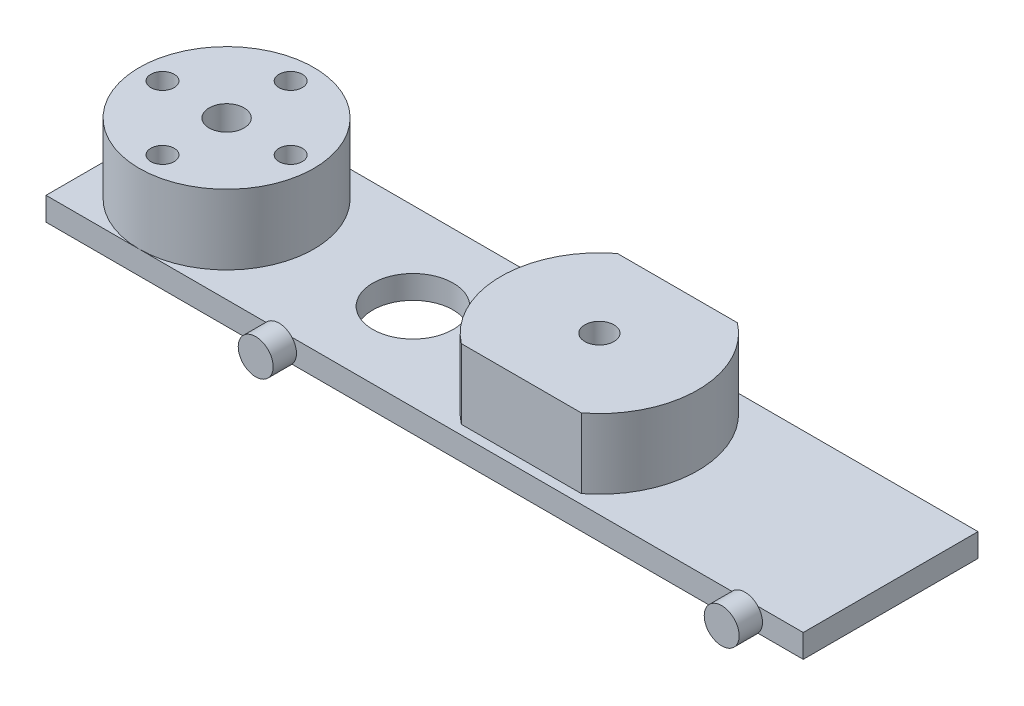
ISO-10303-21;
HEADER;
FILE_DESCRIPTION(('STEP AP214'),'2;1');
FILE_NAME('part.step','',(''),(''),'','','');
FILE_SCHEMA(('AUTOMOTIVE_DESIGN { 1 0 10303 214 1 1 1 1 }'));
ENDSEC;
DATA;
#1=APPLICATION_CONTEXT('core data for automotive mechanical design processes');
#2=APPLICATION_PROTOCOL_DEFINITION('international standard','automotive_design',2000,#1);
#3=PRODUCT_CONTEXT('',#1,'mechanical');
#4=PRODUCT('Part','Part','',(#3));
#5=PRODUCT_RELATED_PRODUCT_CATEGORY('part','',(#4));
#6=PRODUCT_DEFINITION_FORMATION('','',#4);
#7=PRODUCT_DEFINITION_CONTEXT('part definition',#1,'design');
#8=PRODUCT_DEFINITION('design','',#6,#7);
#9=PRODUCT_DEFINITION_SHAPE('','',#8);
#10=(LENGTH_UNIT() NAMED_UNIT(*) SI_UNIT(.MILLI.,.METRE.));
#11=(NAMED_UNIT(*) PLANE_ANGLE_UNIT() SI_UNIT($,.RADIAN.));
#12=(NAMED_UNIT(*) SI_UNIT($,.STERADIAN.) SOLID_ANGLE_UNIT());
#13=UNCERTAINTY_MEASURE_WITH_UNIT(LENGTH_MEASURE(1.E-05),#10,'distance_accuracy_value','');
#14=(GEOMETRIC_REPRESENTATION_CONTEXT(3) GLOBAL_UNCERTAINTY_ASSIGNED_CONTEXT((#13)) GLOBAL_UNIT_ASSIGNED_CONTEXT((#10,
#11,#12)) REPRESENTATION_CONTEXT('',''));
#15=CARTESIAN_POINT('',(0.,0.,0.));
#16=DIRECTION('',(0.,0.,1.));
#17=DIRECTION('',(1.,0.,0.));
#18=AXIS2_PLACEMENT_3D('',#15,#16,#17);
#19=CARTESIAN_POINT('',(0.,0.,0.));
#20=DIRECTION('',(0.,1.,0.));
#21=DIRECTION('',(0.,0.,1.));
#22=AXIS2_PLACEMENT_3D('',#19,#20,#21);
#23=PLANE('',#22);
#24=CARTESIAN_POINT('',(-16.,0.,0.));
#25=DIRECTION('',(0.,-1.,0.));
#26=DIRECTION('',(0.,0.,-1.));
#27=AXIS2_PLACEMENT_3D('',#24,#25,#26);
#28=CIRCLE('',#27,3.45);
#29=CARTESIAN_POINT('',(-16.,0.,-3.45));
#30=VERTEX_POINT('',#29);
#31=EDGE_CURVE('E365',#30,#30,#28,.T.);
#32=ORIENTED_EDGE('',*,*,#31,.F.);
#33=EDGE_LOOP('',(#32));
#34=FACE_BOUND('',#33,.T.);
#35=DIRECTION('',(0.,0.,-1.));
#36=VECTOR('',#35,1.);
#37=CARTESIAN_POINT('',(-40.,0.,0.));
#38=LINE('',#37,#36);
#39=CARTESIAN_POINT('',(-40.,0.,7.5));
#40=VERTEX_POINT('',#39);
#41=CARTESIAN_POINT('',(-40.,0.,-7.5));
#42=VERTEX_POINT('',#41);
#43=EDGE_CURVE('E386',#40,#42,#38,.T.);
#44=ORIENTED_EDGE('',*,*,#43,.T.);
#45=DIRECTION('',(-1.,0.,0.));
#46=VECTOR('',#45,1.);
#47=CARTESIAN_POINT('',(0.,0.,-7.5));
#48=LINE('',#47,#46);
#49=CARTESIAN_POINT('',(25.,0.,-7.5));
#50=VERTEX_POINT('',#49);
#51=EDGE_CURVE('E375',#50,#42,#48,.T.);
#52=ORIENTED_EDGE('',*,*,#51,.F.);
#53=DIRECTION('',(0.,0.,1.));
#54=VECTOR('',#53,1.);
#55=CARTESIAN_POINT('',(25.,0.,-7.5));
#56=LINE('',#55,#54);
#57=CARTESIAN_POINT('',(25.,0.,7.5));
#58=VERTEX_POINT('',#57);
#59=EDGE_CURVE('E369',#50,#58,#56,.T.);
#60=ORIENTED_EDGE('',*,*,#59,.T.);
#61=DIRECTION('',(-1.,0.,0.));
#62=VECTOR('',#61,1.);
#63=CARTESIAN_POINT('',(0.,0.,7.5));
#64=LINE('',#63,#62);
#65=CARTESIAN_POINT('',(21.1180339887499,0.,7.5));
#66=VERTEX_POINT('',#65);
#67=EDGE_CURVE('E392',#58,#66,#64,.T.);
#68=ORIENTED_EDGE('',*,*,#67,.T.);
#69=CARTESIAN_POINT('',(18.8819660112501,0.,7.5));
#70=VERTEX_POINT('',#69);
#71=EDGE_CURVE('E396',#66,#70,#64,.T.);
#72=ORIENTED_EDGE('',*,*,#71,.T.);
#73=CARTESIAN_POINT('',(-18.8819660112501,0.,7.5));
#74=VERTEX_POINT('',#73);
#75=EDGE_CURVE('E630',#70,#74,#64,.T.);
#76=ORIENTED_EDGE('',*,*,#75,.T.);
#77=CARTESIAN_POINT('',(-21.1180339887499,0.,7.5));
#78=VERTEX_POINT('',#77);
#79=EDGE_CURVE('E587',#74,#78,#64,.T.);
#80=ORIENTED_EDGE('',*,*,#79,.T.);
#81=EDGE_CURVE('E390',#78,#40,#64,.T.);
#82=ORIENTED_EDGE('',*,*,#81,.T.);
#83=EDGE_LOOP('',(#44,#52,#60,#68,#72,#76,#80,#82));
#84=FACE_BOUND('',#83,.T.);
#85=CARTESIAN_POINT('',(-32.,0.,0.));
#86=DIRECTION('',(0.,1.,0.));
#87=DIRECTION('',(0.,0.,1.));
#88=AXIS2_PLACEMENT_3D('',#85,#86,#87);
#89=CIRCLE('',#88,7.2);
#90=CARTESIAN_POINT('',(-32.,0.,7.2));
#91=VERTEX_POINT('',#90);
#92=EDGE_CURVE('E280',#91,#91,#89,.T.);
#93=ORIENTED_EDGE('',*,*,#92,.T.);
#94=EDGE_LOOP('',(#93));
#95=FACE_BOUND('',#94,.T.);
#96=DIRECTION('',(-1.,0.,0.));
#97=VECTOR('',#96,1.);
#98=CARTESIAN_POINT('',(0.,0.,6.));
#99=LINE('',#98,#97);
#100=CARTESIAN_POINT('',(4.90535421758714,0.,6.));
#101=VERTEX_POINT('',#100);
#102=CARTESIAN_POINT('',(-4.90535421758714,0.,6.));
#103=VERTEX_POINT('',#102);
#104=EDGE_CURVE('E13',#101,#103,#99,.T.);
#105=ORIENTED_EDGE('',*,*,#104,.F.);
#106=CARTESIAN_POINT('',(0.,0.,0.));
#107=DIRECTION('',(0.,1.,0.));
#108=DIRECTION('',(0.,0.,1.));
#109=AXIS2_PLACEMENT_3D('',#106,#107,#108);
#110=CIRCLE('',#109,7.75);
#111=CARTESIAN_POINT('',(4.90535421758714,0.,-6.));
#112=VERTEX_POINT('',#111);
#113=EDGE_CURVE('E423',#101,#112,#110,.T.);
#114=ORIENTED_EDGE('',*,*,#113,.T.);
#115=DIRECTION('',(-1.,0.,0.));
#116=VECTOR('',#115,1.);
#117=CARTESIAN_POINT('',(0.,0.,-6.));
#118=LINE('',#117,#116);
#119=CARTESIAN_POINT('',(-4.90535421758714,0.,-6.));
#120=VERTEX_POINT('',#119);
#121=EDGE_CURVE('E427',#112,#120,#118,.T.);
#122=ORIENTED_EDGE('',*,*,#121,.T.);
#123=CARTESIAN_POINT('',(0.,0.,0.));
#124=DIRECTION('',(0.,1.,0.));
#125=DIRECTION('',(0.,0.,1.));
#126=AXIS2_PLACEMENT_3D('',#123,#124,#125);
#127=CIRCLE('',#126,7.75);
#128=EDGE_CURVE('E131',#120,#103,#127,.T.);
#129=ORIENTED_EDGE('',*,*,#128,.T.);
#130=EDGE_LOOP('',(#105,#114,#122,#129));
#131=FACE_BOUND('',#130,.T.);
#132=ADVANCED_FACE('F121',(#34,#84,#95,#131),#23,.F.);
#133=CARTESIAN_POINT('',(0.,2.,0.));
#134=DIRECTION('',(0.,1.,0.));
#135=DIRECTION('',(0.,0.,1.));
#136=AXIS2_PLACEMENT_3D('',#133,#134,#135);
#137=PLANE('',#136);
#138=DIRECTION('',(-1.,0.,0.));
#139=VECTOR('',#138,1.);
#140=CARTESIAN_POINT('',(0.,2.,7.5));
#141=LINE('',#140,#139);
#142=CARTESIAN_POINT('',(-32.,2.,7.5));
#143=VERTEX_POINT('',#142);
#144=CARTESIAN_POINT('',(-40.,2.,7.5));
#145=VERTEX_POINT('',#144);
#146=EDGE_CURVE('E374',#143,#145,#141,.T.);
#147=ORIENTED_EDGE('',*,*,#146,.F.);
#148=CARTESIAN_POINT('',(-32.,2.,0.));
#149=DIRECTION('',(0.,1.,0.));
#150=DIRECTION('',(0.,0.,1.));
#151=AXIS2_PLACEMENT_3D('',#148,#149,#150);
#152=CIRCLE('',#151,7.5);
#153=CARTESIAN_POINT('',(-32.,2.,-7.5));
#154=VERTEX_POINT('',#153);
#155=EDGE_CURVE('E303',#154,#143,#152,.T.);
#156=ORIENTED_EDGE('',*,*,#155,.F.);
#157=DIRECTION('',(-1.,0.,0.));
#158=VECTOR('',#157,1.);
#159=CARTESIAN_POINT('',(0.,2.,-7.5));
#160=LINE('',#159,#158);
#161=CARTESIAN_POINT('',(-40.,2.,-7.5));
#162=VERTEX_POINT('',#161);
#163=EDGE_CURVE('E379',#154,#162,#160,.T.);
#164=ORIENTED_EDGE('',*,*,#163,.T.);
#165=DIRECTION('',(0.,0.,-1.));
#166=VECTOR('',#165,1.);
#167=CARTESIAN_POINT('',(-40.,2.,0.));
#168=LINE('',#167,#166);
#169=EDGE_CURVE('E370',#145,#162,#168,.T.);
#170=ORIENTED_EDGE('',*,*,#169,.F.);
#171=EDGE_LOOP('',(#147,#156,#164,#170));
#172=FACE_BOUND('',#171,.T.);
#173=ADVANCED_FACE('F478',(#172),#137,.T.);
#174=CARTESIAN_POINT('',(-16.,2.,0.));
#175=DIRECTION('',(0.,1.,0.));
#176=DIRECTION('',(0.,0.,1.));
#177=AXIS2_PLACEMENT_3D('',#174,#175,#176);
#178=CIRCLE('',#177,3.45);
#179=CARTESIAN_POINT('',(-16.,2.,3.45));
#180=VERTEX_POINT('',#179);
#181=EDGE_CURVE('E346',#180,#180,#178,.F.);
#182=ORIENTED_EDGE('',*,*,#181,.T.);
#183=EDGE_LOOP('',(#182));
#184=FACE_BOUND('',#183,.T.);
#185=DIRECTION('',(-1.,0.,0.));
#186=VECTOR('',#185,1.);
#187=CARTESIAN_POINT('',(5.14902903468217,2.,-6.7));
#188=LINE('',#187,#186);
#189=CARTESIAN_POINT('',(5.14902903468217,2.,-6.7));
#190=VERTEX_POINT('',#189);
#191=CARTESIAN_POINT('',(-5.14902903468217,2.,-6.7));
#192=VERTEX_POINT('',#191);
#193=EDGE_CURVE('E324',#190,#192,#188,.T.);
#194=ORIENTED_EDGE('',*,*,#193,.F.);
#195=CARTESIAN_POINT('',(0.,2.,0.));
#196=DIRECTION('',(0.,1.,0.));
#197=DIRECTION('',(0.,0.,1.));
#198=AXIS2_PLACEMENT_3D('',#195,#196,#197);
#199=CIRCLE('',#198,8.45);
#200=CARTESIAN_POINT('',(5.14902903468217,2.,6.7));
#201=VERTEX_POINT('',#200);
#202=EDGE_CURVE('E327',#201,#190,#199,.T.);
#203=ORIENTED_EDGE('',*,*,#202,.F.);
#204=DIRECTION('',(1.,0.,0.));
#205=VECTOR('',#204,1.);
#206=CARTESIAN_POINT('',(5.14902903468217,2.,6.7));
#207=LINE('',#206,#205);
#208=CARTESIAN_POINT('',(-5.14902903468217,2.,6.7));
#209=VERTEX_POINT('',#208);
#210=EDGE_CURVE('E317',#209,#201,#207,.T.);
#211=ORIENTED_EDGE('',*,*,#210,.F.);
#212=CARTESIAN_POINT('',(0.,2.,0.));
#213=DIRECTION('',(0.,1.,0.));
#214=DIRECTION('',(0.,0.,1.));
#215=AXIS2_PLACEMENT_3D('',#212,#213,#214);
#216=CIRCLE('',#215,8.45);
#217=EDGE_CURVE('E320',#192,#209,#216,.T.);
#218=ORIENTED_EDGE('',*,*,#217,.F.);
#219=EDGE_LOOP('',(#194,#203,#211,#218));
#220=FACE_BOUND('',#219,.T.);
#221=CARTESIAN_POINT('',(25.,2.,-7.5));
#222=VERTEX_POINT('',#221);
#223=EDGE_CURVE('E381',#222,#154,#160,.T.);
#224=ORIENTED_EDGE('',*,*,#223,.T.);
#225=EDGE_CURVE('E300',#143,#154,#152,.T.);
#226=ORIENTED_EDGE('',*,*,#225,.F.);
#227=CARTESIAN_POINT('',(-21.1180339887499,2.,7.5));
#228=VERTEX_POINT('',#227);
#229=EDGE_CURVE('E594',#228,#143,#141,.T.);
#230=ORIENTED_EDGE('',*,*,#229,.F.);
#231=CARTESIAN_POINT('',(-18.8819660112501,2.,7.5));
#232=VERTEX_POINT('',#231);
#233=EDGE_CURVE('E598',#232,#228,#141,.T.);
#234=ORIENTED_EDGE('',*,*,#233,.F.);
#235=CARTESIAN_POINT('',(18.8819660112501,2.,7.5));
#236=VERTEX_POINT('',#235);
#237=EDGE_CURVE('E601',#236,#232,#141,.T.);
#238=ORIENTED_EDGE('',*,*,#237,.F.);
#239=CARTESIAN_POINT('',(21.1180339887499,2.,7.5));
#240=VERTEX_POINT('',#239);
#241=EDGE_CURVE('E380',#240,#236,#141,.T.);
#242=ORIENTED_EDGE('',*,*,#241,.F.);
#243=CARTESIAN_POINT('',(25.,2.,7.5));
#244=VERTEX_POINT('',#243);
#245=EDGE_CURVE('E376',#244,#240,#141,.T.);
#246=ORIENTED_EDGE('',*,*,#245,.F.);
#247=DIRECTION('',(0.,0.,1.));
#248=VECTOR('',#247,1.);
#249=CARTESIAN_POINT('',(25.,2.,-7.5));
#250=LINE('',#249,#248);
#251=EDGE_CURVE('E406',#222,#244,#250,.T.);
#252=ORIENTED_EDGE('',*,*,#251,.F.);
#253=EDGE_LOOP('',(#224,#226,#230,#234,#238,#242,#246,#252));
#254=FACE_BOUND('',#253,.T.);
#255=ADVANCED_FACE('F561',(#184,#220,#254),#137,.T.);
#256=CARTESIAN_POINT('',(0.,2.,7.5));
#257=DIRECTION('',(0.,0.,1.));
#258=DIRECTION('',(1.,0.,0.));
#259=AXIS2_PLACEMENT_3D('',#256,#257,#258);
#260=PLANE('',#259);
#261=CARTESIAN_POINT('',(20.,0.999999999999999,7.5));
#262=DIRECTION('',(0.,0.,1.));
#263=DIRECTION('',(1.,0.,0.));
#264=AXIS2_PLACEMENT_3D('',#261,#262,#263);
#265=CIRCLE('',#264,1.5);
#266=EDGE_CURVE('E428',#236,#70,#265,.T.);
#267=ORIENTED_EDGE('',*,*,#266,.F.);
#268=ORIENTED_EDGE('',*,*,#237,.T.);
#269=CARTESIAN_POINT('',(-20.,0.999999999999995,7.5));
#270=DIRECTION('',(0.,0.,1.));
#271=DIRECTION('',(1.,0.,0.));
#272=AXIS2_PLACEMENT_3D('',#269,#270,#271);
#273=CIRCLE('',#272,1.5);
#274=EDGE_CURVE('E358',#74,#232,#273,.T.);
#275=ORIENTED_EDGE('',*,*,#274,.F.);
#276=ORIENTED_EDGE('',*,*,#75,.F.);
#277=EDGE_LOOP('',(#267,#268,#275,#276));
#278=FACE_BOUND('',#277,.T.);
#279=ADVANCED_FACE('F572',(#278),#260,.T.);
#280=EDGE_CURVE('E620',#228,#78,#273,.T.);
#281=ORIENTED_EDGE('',*,*,#280,.F.);
#282=ORIENTED_EDGE('',*,*,#229,.T.);
#283=ORIENTED_EDGE('',*,*,#146,.T.);
#284=DIRECTION('',(0.,-1.,0.));
#285=VECTOR('',#284,1.);
#286=CARTESIAN_POINT('',(-40.,2.,7.5));
#287=LINE('',#286,#285);
#288=EDGE_CURVE('E402',#145,#40,#287,.T.);
#289=ORIENTED_EDGE('',*,*,#288,.T.);
#290=ORIENTED_EDGE('',*,*,#81,.F.);
#291=EDGE_LOOP('',(#281,#282,#283,#289,#290));
#292=FACE_BOUND('',#291,.T.);
#293=ADVANCED_FACE('F568',(#292),#260,.T.);
#294=CARTESIAN_POINT('',(0.,2.,-7.5));
#295=DIRECTION('',(0.,0.,1.));
#296=DIRECTION('',(1.,0.,0.));
#297=AXIS2_PLACEMENT_3D('',#294,#295,#296);
#298=PLANE('',#297);
#299=ORIENTED_EDGE('',*,*,#51,.T.);
#300=DIRECTION('',(0.,-1.,0.));
#301=VECTOR('',#300,1.);
#302=CARTESIAN_POINT('',(-40.,2.,-7.5));
#303=LINE('',#302,#301);
#304=EDGE_CURVE('E385',#162,#42,#303,.T.);
#305=ORIENTED_EDGE('',*,*,#304,.F.);
#306=ORIENTED_EDGE('',*,*,#163,.F.);
#307=ORIENTED_EDGE('',*,*,#223,.F.);
#308=DIRECTION('',(0.,-1.,0.));
#309=VECTOR('',#308,1.);
#310=CARTESIAN_POINT('',(25.,2.,-7.5));
#311=LINE('',#310,#309);
#312=EDGE_CURVE('E410',#222,#50,#311,.T.);
#313=ORIENTED_EDGE('',*,*,#312,.T.);
#314=EDGE_LOOP('',(#299,#305,#306,#307,#313));
#315=FACE_BOUND('',#314,.T.);
#316=ADVANCED_FACE('F564',(#315),#298,.F.);
#317=EDGE_CURVE('E352',#66,#240,#265,.T.);
#318=ORIENTED_EDGE('',*,*,#317,.F.);
#319=ORIENTED_EDGE('',*,*,#67,.F.);
#320=DIRECTION('',(0.,-1.,0.));
#321=VECTOR('',#320,1.);
#322=CARTESIAN_POINT('',(25.,2.,7.5));
#323=LINE('',#322,#321);
#324=EDGE_CURVE('E391',#244,#58,#323,.T.);
#325=ORIENTED_EDGE('',*,*,#324,.F.);
#326=ORIENTED_EDGE('',*,*,#245,.T.);
#327=EDGE_LOOP('',(#318,#319,#325,#326));
#328=FACE_BOUND('',#327,.T.);
#329=ADVANCED_FACE('F567',(#328),#260,.T.);
#330=CARTESIAN_POINT('',(-40.,2.,0.));
#331=DIRECTION('',(-1.,0.,0.));
#332=DIRECTION('',(0.,0.,1.));
#333=AXIS2_PLACEMENT_3D('',#330,#331,#332);
#334=PLANE('',#333);
#335=ORIENTED_EDGE('',*,*,#43,.F.);
#336=ORIENTED_EDGE('',*,*,#288,.F.);
#337=ORIENTED_EDGE('',*,*,#169,.T.);
#338=ORIENTED_EDGE('',*,*,#304,.T.);
#339=EDGE_LOOP('',(#335,#336,#337,#338));
#340=FACE_BOUND('',#339,.T.);
#341=ADVANCED_FACE('F559',(#340),#334,.T.);
#342=CARTESIAN_POINT('',(25.,2.,-7.5));
#343=DIRECTION('',(1.,0.,0.));
#344=DIRECTION('',(0.,0.,-1.));
#345=AXIS2_PLACEMENT_3D('',#342,#343,#344);
#346=PLANE('',#345);
#347=ORIENTED_EDGE('',*,*,#59,.F.);
#348=ORIENTED_EDGE('',*,*,#312,.F.);
#349=ORIENTED_EDGE('',*,*,#251,.T.);
#350=ORIENTED_EDGE('',*,*,#324,.T.);
#351=EDGE_LOOP('',(#347,#348,#349,#350));
#352=FACE_BOUND('',#351,.T.);
#353=ADVANCED_FACE('F123',(#352),#346,.T.);
#354=CARTESIAN_POINT('',(-16.,11.7580735803744,0.));
#355=DIRECTION('',(0.,-1.,0.));
#356=DIRECTION('',(0.,0.,-1.));
#357=AXIS2_PLACEMENT_3D('',#354,#355,#356);
#358=CYLINDRICAL_SURFACE('',#357,3.45);
#359=ORIENTED_EDGE('',*,*,#31,.T.);
#360=EDGE_LOOP('',(#359));
#361=FACE_BOUND('',#360,.T.);
#362=ORIENTED_EDGE('',*,*,#181,.F.);
#363=EDGE_LOOP('',(#362));
#364=FACE_BOUND('',#363,.T.);
#365=ADVANCED_FACE('F554',(#361,#364),#358,.F.);
#366=CARTESIAN_POINT('',(0.,11.7580735803744,0.));
#367=DIRECTION('',(0.,-1.,0.));
#368=DIRECTION('',(0.,0.,-1.));
#369=AXIS2_PLACEMENT_3D('',#366,#367,#368);
#370=CYLINDRICAL_SURFACE('',#369,1.25);
#371=CARTESIAN_POINT('',(0.,5.5,0.));
#372=DIRECTION('',(0.,1.,0.));
#373=DIRECTION('',(0.,0.,1.));
#374=AXIS2_PLACEMENT_3D('',#371,#372,#373);
#375=CIRCLE('',#374,1.25);
#376=CARTESIAN_POINT('',(0.,5.5,1.25));
#377=VERTEX_POINT('',#376);
#378=EDGE_CURVE('E265',#377,#377,#375,.F.);
#379=ORIENTED_EDGE('',*,*,#378,.T.);
#380=EDGE_LOOP('',(#379));
#381=FACE_BOUND('',#380,.T.);
#382=CARTESIAN_POINT('',(0.,8.,0.));
#383=DIRECTION('',(0.,1.,0.));
#384=DIRECTION('',(0.,0.,1.));
#385=AXIS2_PLACEMENT_3D('',#382,#383,#384);
#386=CIRCLE('',#385,1.25);
#387=CARTESIAN_POINT('',(0.,8.,1.25));
#388=VERTEX_POINT('',#387);
#389=EDGE_CURVE('E290',#388,#388,#386,.F.);
#390=ORIENTED_EDGE('',*,*,#389,.F.);
#391=EDGE_LOOP('',(#390));
#392=FACE_BOUND('',#391,.T.);
#393=ADVANCED_FACE('F551',(#381,#392),#370,.F.);
#394=CARTESIAN_POINT('',(-20.,0.999999999999995,7.5));
#395=DIRECTION('',(0.,0.,1.));
#396=DIRECTION('',(1.,0.,0.));
#397=AXIS2_PLACEMENT_3D('',#394,#395,#396);
#398=PLANE('',#397);
#399=EDGE_CURVE('E353',#232,#228,#273,.T.);
#400=ORIENTED_EDGE('',*,*,#399,.F.);
#401=ORIENTED_EDGE('',*,*,#233,.T.);
#402=EDGE_LOOP('',(#400,#401));
#403=FACE_BOUND('',#402,.T.);
#404=ADVANCED_FACE('F542',(#403),#398,.F.);
#405=CARTESIAN_POINT('',(-20.,0.999999999999995,9.5));
#406=DIRECTION('',(0.,0.,-1.));
#407=DIRECTION('',(-1.,0.,0.));
#408=AXIS2_PLACEMENT_3D('',#405,#406,#407);
#409=CYLINDRICAL_SURFACE('',#408,1.5);
#410=CARTESIAN_POINT('',(-20.,0.999999999999995,9.5));
#411=DIRECTION('',(0.,0.,1.));
#412=DIRECTION('',(1.,0.,0.));
#413=AXIS2_PLACEMENT_3D('',#410,#411,#412);
#414=CIRCLE('',#413,1.5);
#415=CARTESIAN_POINT('',(-18.5,0.999999999999995,9.5));
#416=VERTEX_POINT('',#415);
#417=EDGE_CURVE('E299',#416,#416,#414,.T.);
#418=ORIENTED_EDGE('',*,*,#417,.F.);
#419=EDGE_LOOP('',(#418));
#420=FACE_BOUND('',#419,.T.);
#421=ORIENTED_EDGE('',*,*,#399,.T.);
#422=ORIENTED_EDGE('',*,*,#280,.T.);
#423=EDGE_CURVE('E357',#78,#74,#273,.T.);
#424=ORIENTED_EDGE('',*,*,#423,.T.);
#425=ORIENTED_EDGE('',*,*,#274,.T.);
#426=EDGE_LOOP('',(#421,#422,#424,#425));
#427=FACE_BOUND('',#426,.T.);
#428=ADVANCED_FACE('F538',(#420,#427),#409,.T.);
#429=CARTESIAN_POINT('',(-20.,0.999999999999995,9.5));
#430=DIRECTION('',(0.,0.,1.));
#431=DIRECTION('',(1.,0.,0.));
#432=AXIS2_PLACEMENT_3D('',#429,#430,#431);
#433=PLANE('',#432);
#434=ORIENTED_EDGE('',*,*,#417,.T.);
#435=EDGE_LOOP('',(#434));
#436=FACE_BOUND('',#435,.T.);
#437=ADVANCED_FACE('F541',(#436),#433,.T.);
#438=ORIENTED_EDGE('',*,*,#79,.F.);
#439=ORIENTED_EDGE('',*,*,#423,.F.);
#440=EDGE_LOOP('',(#438,#439));
#441=FACE_BOUND('',#440,.T.);
#442=ADVANCED_FACE('F544',(#441),#398,.F.);
#443=CARTESIAN_POINT('',(20.,0.999999999999999,7.5));
#444=DIRECTION('',(0.,0.,1.));
#445=DIRECTION('',(1.,0.,0.));
#446=AXIS2_PLACEMENT_3D('',#443,#444,#445);
#447=PLANE('',#446);
#448=EDGE_CURVE('E347',#240,#236,#265,.T.);
#449=ORIENTED_EDGE('',*,*,#448,.F.);
#450=ORIENTED_EDGE('',*,*,#241,.T.);
#451=EDGE_LOOP('',(#449,#450));
#452=FACE_BOUND('',#451,.T.);
#453=ADVANCED_FACE('F534',(#452),#447,.F.);
#454=CARTESIAN_POINT('',(20.,0.999999999999999,9.5));
#455=DIRECTION('',(0.,0.,-1.));
#456=DIRECTION('',(-1.,0.,0.));
#457=AXIS2_PLACEMENT_3D('',#454,#455,#456);
#458=CYLINDRICAL_SURFACE('',#457,1.5);
#459=CARTESIAN_POINT('',(20.,0.999999999999999,9.5));
#460=DIRECTION('',(0.,0.,1.));
#461=DIRECTION('',(1.,0.,0.));
#462=AXIS2_PLACEMENT_3D('',#459,#460,#461);
#463=CIRCLE('',#462,1.5);
#464=CARTESIAN_POINT('',(21.5,0.999999999999999,9.5));
#465=VERTEX_POINT('',#464);
#466=EDGE_CURVE('E342',#465,#465,#463,.T.);
#467=ORIENTED_EDGE('',*,*,#466,.F.);
#468=EDGE_LOOP('',(#467));
#469=FACE_BOUND('',#468,.T.);
#470=ORIENTED_EDGE('',*,*,#448,.T.);
#471=ORIENTED_EDGE('',*,*,#266,.T.);
#472=EDGE_CURVE('E351',#70,#66,#265,.T.);
#473=ORIENTED_EDGE('',*,*,#472,.T.);
#474=ORIENTED_EDGE('',*,*,#317,.T.);
#475=EDGE_LOOP('',(#470,#471,#473,#474));
#476=FACE_BOUND('',#475,.T.);
#477=ADVANCED_FACE('F529',(#469,#476),#458,.T.);
#478=CARTESIAN_POINT('',(20.,0.999999999999999,9.5));
#479=DIRECTION('',(0.,0.,1.));
#480=DIRECTION('',(1.,0.,0.));
#481=AXIS2_PLACEMENT_3D('',#478,#479,#480);
#482=PLANE('',#481);
#483=ORIENTED_EDGE('',*,*,#466,.T.);
#484=EDGE_LOOP('',(#483));
#485=FACE_BOUND('',#484,.T.);
#486=ADVANCED_FACE('F526',(#485),#482,.T.);
#487=ORIENTED_EDGE('',*,*,#71,.F.);
#488=ORIENTED_EDGE('',*,*,#472,.F.);
#489=EDGE_LOOP('',(#487,#488));
#490=FACE_BOUND('',#489,.T.);
#491=ADVANCED_FACE('F524',(#490),#447,.F.);
#492=CARTESIAN_POINT('',(0.,8.,0.));
#493=DIRECTION('',(0.,1.,0.));
#494=DIRECTION('',(0.,0.,1.));
#495=AXIS2_PLACEMENT_3D('',#492,#493,#494);
#496=PLANE('',#495);
#497=CARTESIAN_POINT('',(0.,8.,0.));
#498=DIRECTION('',(0.,1.,0.));
#499=DIRECTION('',(0.,0.,1.));
#500=AXIS2_PLACEMENT_3D('',#497,#498,#499);
#501=CIRCLE('',#500,8.45);
#502=CARTESIAN_POINT('',(5.14902903468217,8.,6.7));
#503=VERTEX_POINT('',#502);
#504=CARTESIAN_POINT('',(5.14902903468217,8.,-6.7));
#505=VERTEX_POINT('',#504);
#506=EDGE_CURVE('E321',#503,#505,#501,.T.);
#507=ORIENTED_EDGE('',*,*,#506,.T.);
#508=DIRECTION('',(-1.,0.,0.));
#509=VECTOR('',#508,1.);
#510=CARTESIAN_POINT('',(5.14902903468217,8.,-6.7));
#511=LINE('',#510,#509);
#512=CARTESIAN_POINT('',(-5.14902903468217,8.,-6.7));
#513=VERTEX_POINT('',#512);
#514=EDGE_CURVE('E336',#505,#513,#511,.T.);
#515=ORIENTED_EDGE('',*,*,#514,.T.);
#516=CARTESIAN_POINT('',(0.,8.,0.));
#517=DIRECTION('',(0.,1.,0.));
#518=DIRECTION('',(0.,0.,1.));
#519=AXIS2_PLACEMENT_3D('',#516,#517,#518);
#520=CIRCLE('',#519,8.45);
#521=CARTESIAN_POINT('',(-5.14902903468217,8.,6.7));
#522=VERTEX_POINT('',#521);
#523=EDGE_CURVE('E333',#513,#522,#520,.T.);
#524=ORIENTED_EDGE('',*,*,#523,.T.);
#525=DIRECTION('',(1.,0.,0.));
#526=VECTOR('',#525,1.);
#527=CARTESIAN_POINT('',(5.14902903468217,8.,6.7));
#528=LINE('',#527,#526);
#529=EDGE_CURVE('E316',#522,#503,#528,.T.);
#530=ORIENTED_EDGE('',*,*,#529,.T.);
#531=EDGE_LOOP('',(#507,#515,#524,#530));
#532=FACE_BOUND('',#531,.T.);
#533=ORIENTED_EDGE('',*,*,#389,.T.);
#534=EDGE_LOOP('',(#533));
#535=FACE_BOUND('',#534,.T.);
#536=ADVANCED_FACE('F511',(#532,#535),#496,.T.);
#537=CARTESIAN_POINT('',(0.,8.,0.));
#538=DIRECTION('',(0.,-1.,0.));
#539=DIRECTION('',(0.,0.,-1.));
#540=AXIS2_PLACEMENT_3D('',#537,#538,#539);
#541=CYLINDRICAL_SURFACE('',#540,8.45);
#542=ORIENTED_EDGE('',*,*,#202,.T.);
#543=DIRECTION('',(0.,-1.,0.));
#544=VECTOR('',#543,1.);
#545=CARTESIAN_POINT('',(5.14902903468217,8.,-6.7));
#546=LINE('',#545,#544);
#547=EDGE_CURVE('E294',#505,#190,#546,.T.);
#548=ORIENTED_EDGE('',*,*,#547,.F.);
#549=ORIENTED_EDGE('',*,*,#506,.F.);
#550=DIRECTION('',(0.,-1.,0.));
#551=VECTOR('',#550,1.);
#552=CARTESIAN_POINT('',(5.14902903468217,8.,6.7));
#553=LINE('',#552,#551);
#554=EDGE_CURVE('E312',#503,#201,#553,.T.);
#555=ORIENTED_EDGE('',*,*,#554,.T.);
#556=EDGE_LOOP('',(#542,#548,#549,#555));
#557=FACE_BOUND('',#556,.T.);
#558=ADVANCED_FACE('F507',(#557),#541,.T.);
#559=CARTESIAN_POINT('',(5.14902903468217,8.,-6.7));
#560=DIRECTION('',(0.,0.,1.));
#561=DIRECTION('',(1.,0.,0.));
#562=AXIS2_PLACEMENT_3D('',#559,#560,#561);
#563=PLANE('',#562);
#564=ORIENTED_EDGE('',*,*,#193,.T.);
#565=DIRECTION('',(0.,-1.,0.));
#566=VECTOR('',#565,1.);
#567=CARTESIAN_POINT('',(-5.14902903468217,8.,-6.7));
#568=LINE('',#567,#566);
#569=EDGE_CURVE('E306',#513,#192,#568,.T.);
#570=ORIENTED_EDGE('',*,*,#569,.F.);
#571=ORIENTED_EDGE('',*,*,#514,.F.);
#572=ORIENTED_EDGE('',*,*,#547,.T.);
#573=EDGE_LOOP('',(#564,#570,#571,#572));
#574=FACE_BOUND('',#573,.T.);
#575=ADVANCED_FACE('F510',(#574),#563,.F.);
#576=CARTESIAN_POINT('',(0.,8.,0.));
#577=DIRECTION('',(0.,-1.,0.));
#578=DIRECTION('',(0.,0.,-1.));
#579=AXIS2_PLACEMENT_3D('',#576,#577,#578);
#580=CYLINDRICAL_SURFACE('',#579,8.45);
#581=ORIENTED_EDGE('',*,*,#217,.T.);
#582=DIRECTION('',(0.,-1.,0.));
#583=VECTOR('',#582,1.);
#584=CARTESIAN_POINT('',(-5.14902903468217,8.,6.7));
#585=LINE('',#584,#583);
#586=EDGE_CURVE('E147',#522,#209,#585,.T.);
#587=ORIENTED_EDGE('',*,*,#586,.F.);
#588=ORIENTED_EDGE('',*,*,#523,.F.);
#589=ORIENTED_EDGE('',*,*,#569,.T.);
#590=EDGE_LOOP('',(#581,#587,#588,#589));
#591=FACE_BOUND('',#590,.T.);
#592=ADVANCED_FACE('F515',(#591),#580,.T.);
#593=CARTESIAN_POINT('',(5.14902903468217,8.,6.7));
#594=DIRECTION('',(0.,0.,-1.));
#595=DIRECTION('',(-1.,0.,0.));
#596=AXIS2_PLACEMENT_3D('',#593,#594,#595);
#597=PLANE('',#596);
#598=ORIENTED_EDGE('',*,*,#210,.T.);
#599=ORIENTED_EDGE('',*,*,#554,.F.);
#600=ORIENTED_EDGE('',*,*,#529,.F.);
#601=ORIENTED_EDGE('',*,*,#586,.T.);
#602=EDGE_LOOP('',(#598,#599,#600,#601));
#603=FACE_BOUND('',#602,.T.);
#604=ADVANCED_FACE('F502',(#603),#597,.F.);
#605=CARTESIAN_POINT('',(-32.,8.,0.));
#606=DIRECTION('',(0.,1.,0.));
#607=DIRECTION('',(0.,0.,1.));
#608=AXIS2_PLACEMENT_3D('',#605,#606,#607);
#609=PLANE('',#608);
#610=CARTESIAN_POINT('',(-32.,8.,-5.5));
#611=DIRECTION('',(0.,1.,0.));
#612=DIRECTION('',(0.,0.,1.));
#613=AXIS2_PLACEMENT_3D('',#610,#611,#612);
#614=CIRCLE('',#613,0.999999999999991);
#615=CARTESIAN_POINT('',(-32.,8.,-4.50000000000001));
#616=VERTEX_POINT('',#615);
#617=EDGE_CURVE('E813',#616,#616,#614,.T.);
#618=ORIENTED_EDGE('',*,*,#617,.F.);
#619=EDGE_LOOP('',(#618));
#620=FACE_BOUND('',#619,.T.);
#621=CARTESIAN_POINT('',(-37.5,8.,0.));
#622=DIRECTION('',(0.,1.,0.));
#623=DIRECTION('',(0.,0.,1.));
#624=AXIS2_PLACEMENT_3D('',#621,#622,#623);
#625=CIRCLE('',#624,0.999999999999991);
#626=CARTESIAN_POINT('',(-37.5,8.,0.999999999999992));
#627=VERTEX_POINT('',#626);
#628=EDGE_CURVE('E815',#627,#627,#625,.T.);
#629=ORIENTED_EDGE('',*,*,#628,.F.);
#630=EDGE_LOOP('',(#629));
#631=FACE_BOUND('',#630,.T.);
#632=CARTESIAN_POINT('',(-32.,8.,5.5));
#633=DIRECTION('',(0.,1.,0.));
#634=DIRECTION('',(0.,0.,1.));
#635=AXIS2_PLACEMENT_3D('',#632,#633,#634);
#636=CIRCLE('',#635,0.999999999999998);
#637=CARTESIAN_POINT('',(-32.,8.,6.5));
#638=VERTEX_POINT('',#637);
#639=EDGE_CURVE('E821',#638,#638,#636,.T.);
#640=ORIENTED_EDGE('',*,*,#639,.F.);
#641=EDGE_LOOP('',(#640));
#642=FACE_BOUND('',#641,.T.);
#643=CARTESIAN_POINT('',(-26.5,8.,0.));
#644=DIRECTION('',(0.,1.,0.));
#645=DIRECTION('',(0.,0.,1.));
#646=AXIS2_PLACEMENT_3D('',#643,#644,#645);
#647=CIRCLE('',#646,0.999999999999998);
#648=CARTESIAN_POINT('',(-26.5,8.,0.999999999999999));
#649=VERTEX_POINT('',#648);
#650=EDGE_CURVE('E824',#649,#649,#647,.T.);
#651=ORIENTED_EDGE('',*,*,#650,.F.);
#652=EDGE_LOOP('',(#651));
#653=FACE_BOUND('',#652,.T.);
#654=CARTESIAN_POINT('',(-32.,8.,0.));
#655=DIRECTION('',(0.,1.,0.));
#656=DIRECTION('',(0.,0.,1.));
#657=AXIS2_PLACEMENT_3D('',#654,#655,#656);
#658=CIRCLE('',#657,1.5);
#659=CARTESIAN_POINT('',(-32.,8.,1.50000000000001));
#660=VERTEX_POINT('',#659);
#661=EDGE_CURVE('E438',#660,#660,#658,.T.);
#662=ORIENTED_EDGE('',*,*,#661,.F.);
#663=EDGE_LOOP('',(#662));
#664=FACE_BOUND('',#663,.T.);
#665=CARTESIAN_POINT('',(-32.,8.,0.));
#666=DIRECTION('',(0.,1.,0.));
#667=DIRECTION('',(0.,0.,1.));
#668=AXIS2_PLACEMENT_3D('',#665,#666,#667);
#669=CIRCLE('',#668,7.5);
#670=CARTESIAN_POINT('',(-32.,8.,7.5));
#671=VERTEX_POINT('',#670);
#672=EDGE_CURVE('E295',#671,#671,#669,.T.);
#673=ORIENTED_EDGE('',*,*,#672,.T.);
#674=EDGE_LOOP('',(#673));
#675=FACE_BOUND('',#674,.T.);
#676=ADVANCED_FACE('F499',(#620,#631,#642,#653,#664,#675),#609,.T.);
#677=CARTESIAN_POINT('',(-32.,8.,0.));
#678=DIRECTION('',(0.,-1.,0.));
#679=DIRECTION('',(0.,0.,-1.));
#680=AXIS2_PLACEMENT_3D('',#677,#678,#679);
#681=CYLINDRICAL_SURFACE('',#680,7.5);
#682=ORIENTED_EDGE('',*,*,#672,.F.);
#683=EDGE_LOOP('',(#682));
#684=FACE_BOUND('',#683,.T.);
#685=ORIENTED_EDGE('',*,*,#225,.T.);
#686=ORIENTED_EDGE('',*,*,#155,.T.);
#687=EDGE_LOOP('',(#685,#686));
#688=FACE_BOUND('',#687,.T.);
#689=ADVANCED_FACE('F497',(#684,#688),#681,.T.);
#690=CARTESIAN_POINT('',(0.,-0.500000000000006,6.));
#691=DIRECTION('',(0.,0.,-1.));
#692=DIRECTION('',(-1.,0.,0.));
#693=AXIS2_PLACEMENT_3D('',#690,#691,#692);
#694=PLANE('',#693);
#695=ORIENTED_EDGE('',*,*,#104,.T.);
#696=DIRECTION('',(0.,1.,0.));
#697=VECTOR('',#696,1.);
#698=CARTESIAN_POINT('',(-4.90535421758714,-0.500000000000006,6.));
#699=LINE('',#698,#697);
#700=CARTESIAN_POINT('',(-4.90535421758714,5.5,6.));
#701=VERTEX_POINT('',#700);
#702=EDGE_CURVE('E253',#103,#701,#699,.T.);
#703=ORIENTED_EDGE('',*,*,#702,.T.);
#704=DIRECTION('',(-1.,0.,0.));
#705=VECTOR('',#704,1.);
#706=CARTESIAN_POINT('',(0.,5.5,6.));
#707=LINE('',#706,#705);
#708=CARTESIAN_POINT('',(4.90535421758714,5.5,6.));
#709=VERTEX_POINT('',#708);
#710=EDGE_CURVE('E263',#709,#701,#707,.T.);
#711=ORIENTED_EDGE('',*,*,#710,.F.);
#712=DIRECTION('',(0.,1.,0.));
#713=VECTOR('',#712,1.);
#714=CARTESIAN_POINT('',(4.90535421758714,-0.500000000000006,6.));
#715=LINE('',#714,#713);
#716=EDGE_CURVE('E284',#101,#709,#715,.T.);
#717=ORIENTED_EDGE('',*,*,#716,.F.);
#718=EDGE_LOOP('',(#695,#703,#711,#717));
#719=FACE_BOUND('',#718,.T.);
#720=ADVANCED_FACE('F484',(#719),#694,.T.);
#721=CARTESIAN_POINT('',(0.,-0.500000000000006,0.));
#722=DIRECTION('',(0.,1.,0.));
#723=DIRECTION('',(0.,0.,1.));
#724=AXIS2_PLACEMENT_3D('',#721,#722,#723);
#725=CYLINDRICAL_SURFACE('',#724,7.75);
#726=DIRECTION('',(0.,1.,0.));
#727=VECTOR('',#726,1.);
#728=CARTESIAN_POINT('',(-4.90535421758714,-0.500000000000006,-6.));
#729=LINE('',#728,#727);
#730=CARTESIAN_POINT('',(-4.90535421758714,5.5,-6.));
#731=VERTEX_POINT('',#730);
#732=EDGE_CURVE('E243',#120,#731,#729,.T.);
#733=ORIENTED_EDGE('',*,*,#732,.T.);
#734=CARTESIAN_POINT('',(0.,5.5,0.));
#735=DIRECTION('',(0.,1.,0.));
#736=DIRECTION('',(0.,0.,1.));
#737=AXIS2_PLACEMENT_3D('',#734,#735,#736);
#738=CIRCLE('',#737,7.75);
#739=EDGE_CURVE('E247',#731,#701,#738,.T.);
#740=ORIENTED_EDGE('',*,*,#739,.T.);
#741=ORIENTED_EDGE('',*,*,#702,.F.);
#742=ORIENTED_EDGE('',*,*,#128,.F.);
#743=EDGE_LOOP('',(#733,#740,#741,#742));
#744=FACE_BOUND('',#743,.T.);
#745=ADVANCED_FACE('F245',(#744),#725,.F.);
#746=CARTESIAN_POINT('',(0.,-0.500000000000006,-6.));
#747=DIRECTION('',(0.,0.,-1.));
#748=DIRECTION('',(-1.,0.,0.));
#749=AXIS2_PLACEMENT_3D('',#746,#747,#748);
#750=PLANE('',#749);
#751=DIRECTION('',(0.,1.,0.));
#752=VECTOR('',#751,1.);
#753=CARTESIAN_POINT('',(4.90535421758714,-0.500000000000006,-6.));
#754=LINE('',#753,#752);
#755=CARTESIAN_POINT('',(4.90535421758714,5.5,-6.));
#756=VERTEX_POINT('',#755);
#757=EDGE_CURVE('E139',#112,#756,#754,.T.);
#758=ORIENTED_EDGE('',*,*,#757,.T.);
#759=DIRECTION('',(-1.,0.,0.));
#760=VECTOR('',#759,1.);
#761=CARTESIAN_POINT('',(0.,5.5,-6.));
#762=LINE('',#761,#760);
#763=EDGE_CURVE('E261',#756,#731,#762,.T.);
#764=ORIENTED_EDGE('',*,*,#763,.T.);
#765=ORIENTED_EDGE('',*,*,#732,.F.);
#766=ORIENTED_EDGE('',*,*,#121,.F.);
#767=EDGE_LOOP('',(#758,#764,#765,#766));
#768=FACE_BOUND('',#767,.T.);
#769=ADVANCED_FACE('F267',(#768),#750,.F.);
#770=CARTESIAN_POINT('',(0.,-0.500000000000006,0.));
#771=DIRECTION('',(0.,1.,0.));
#772=DIRECTION('',(0.,0.,1.));
#773=AXIS2_PLACEMENT_3D('',#770,#771,#772);
#774=CYLINDRICAL_SURFACE('',#773,7.75);
#775=ORIENTED_EDGE('',*,*,#716,.T.);
#776=CARTESIAN_POINT('',(0.,5.5,0.));
#777=DIRECTION('',(0.,1.,0.));
#778=DIRECTION('',(0.,0.,1.));
#779=AXIS2_PLACEMENT_3D('',#776,#777,#778);
#780=CIRCLE('',#779,7.75);
#781=EDGE_CURVE('E269',#709,#756,#780,.T.);
#782=ORIENTED_EDGE('',*,*,#781,.T.);
#783=ORIENTED_EDGE('',*,*,#757,.F.);
#784=ORIENTED_EDGE('',*,*,#113,.F.);
#785=EDGE_LOOP('',(#775,#782,#783,#784));
#786=FACE_BOUND('',#785,.T.);
#787=ADVANCED_FACE('F485',(#786),#774,.F.);
#788=CARTESIAN_POINT('',(0.,5.5,0.));
#789=DIRECTION('',(0.,1.,0.));
#790=DIRECTION('',(0.,0.,1.));
#791=AXIS2_PLACEMENT_3D('',#788,#789,#790);
#792=PLANE('',#791);
#793=ORIENTED_EDGE('',*,*,#710,.T.);
#794=ORIENTED_EDGE('',*,*,#739,.F.);
#795=ORIENTED_EDGE('',*,*,#763,.F.);
#796=ORIENTED_EDGE('',*,*,#781,.F.);
#797=EDGE_LOOP('',(#793,#794,#795,#796));
#798=FACE_BOUND('',#797,.T.);
#799=ORIENTED_EDGE('',*,*,#378,.F.);
#800=EDGE_LOOP('',(#799));
#801=FACE_BOUND('',#800,.T.);
#802=ADVANCED_FACE('F258',(#798,#801),#792,.F.);
#803=CARTESIAN_POINT('',(-32.,-0.500000000000006,0.));
#804=DIRECTION('',(0.,1.,0.));
#805=DIRECTION('',(0.,0.,1.));
#806=AXIS2_PLACEMENT_3D('',#803,#804,#805);
#807=CYLINDRICAL_SURFACE('',#806,7.2);
#808=CARTESIAN_POINT('',(-32.,5.5,0.));
#809=DIRECTION('',(0.,1.,0.));
#810=DIRECTION('',(0.,0.,1.));
#811=AXIS2_PLACEMENT_3D('',#808,#809,#810);
#812=CIRCLE('',#811,7.2);
#813=CARTESIAN_POINT('',(-32.,5.5,7.2));
#814=VERTEX_POINT('',#813);
#815=EDGE_CURVE('E277',#814,#814,#812,.T.);
#816=ORIENTED_EDGE('',*,*,#815,.T.);
#817=EDGE_LOOP('',(#816));
#818=FACE_BOUND('',#817,.T.);
#819=ORIENTED_EDGE('',*,*,#92,.F.);
#820=EDGE_LOOP('',(#819));
#821=FACE_BOUND('',#820,.T.);
#822=ADVANCED_FACE('F460',(#818,#821),#807,.F.);
#823=CARTESIAN_POINT('',(0.,5.5,0.));
#824=DIRECTION('',(0.,1.,0.));
#825=DIRECTION('',(0.,0.,1.));
#826=AXIS2_PLACEMENT_3D('',#823,#824,#825);
#827=PLANE('',#826);
#828=CARTESIAN_POINT('',(-32.,5.5,-5.5));
#829=DIRECTION('',(0.,1.,0.));
#830=DIRECTION('',(0.,0.,1.));
#831=AXIS2_PLACEMENT_3D('',#828,#829,#830);
#832=CIRCLE('',#831,0.999999999999991);
#833=CARTESIAN_POINT('',(-32.,5.5,-4.50000000000001));
#834=VERTEX_POINT('',#833);
#835=EDGE_CURVE('E125',#834,#834,#832,.F.);
#836=ORIENTED_EDGE('',*,*,#835,.F.);
#837=EDGE_LOOP('',(#836));
#838=FACE_BOUND('',#837,.T.);
#839=CARTESIAN_POINT('',(-37.5,5.5,0.));
#840=DIRECTION('',(0.,1.,0.));
#841=DIRECTION('',(0.,0.,1.));
#842=AXIS2_PLACEMENT_3D('',#839,#840,#841);
#843=CIRCLE('',#842,0.999999999999991);
#844=CARTESIAN_POINT('',(-37.5,5.5,0.999999999999992));
#845=VERTEX_POINT('',#844);
#846=EDGE_CURVE('E445',#845,#845,#843,.F.);
#847=ORIENTED_EDGE('',*,*,#846,.F.);
#848=EDGE_LOOP('',(#847));
#849=FACE_BOUND('',#848,.T.);
#850=CARTESIAN_POINT('',(-32.,5.5,5.5));
#851=DIRECTION('',(0.,1.,0.));
#852=DIRECTION('',(0.,0.,1.));
#853=AXIS2_PLACEMENT_3D('',#850,#851,#852);
#854=CIRCLE('',#853,0.999999999999998);
#855=CARTESIAN_POINT('',(-32.,5.5,6.5));
#856=VERTEX_POINT('',#855);
#857=EDGE_CURVE('E442',#856,#856,#854,.F.);
#858=ORIENTED_EDGE('',*,*,#857,.F.);
#859=EDGE_LOOP('',(#858));
#860=FACE_BOUND('',#859,.T.);
#861=CARTESIAN_POINT('',(-26.5,5.5,0.));
#862=DIRECTION('',(0.,1.,0.));
#863=DIRECTION('',(0.,0.,1.));
#864=AXIS2_PLACEMENT_3D('',#861,#862,#863);
#865=CIRCLE('',#864,0.999999999999998);
#866=CARTESIAN_POINT('',(-26.5,5.5,0.999999999999999));
#867=VERTEX_POINT('',#866);
#868=EDGE_CURVE('E437',#867,#867,#865,.F.);
#869=ORIENTED_EDGE('',*,*,#868,.F.);
#870=EDGE_LOOP('',(#869));
#871=FACE_BOUND('',#870,.T.);
#872=CARTESIAN_POINT('',(-32.,5.5,0.));
#873=DIRECTION('',(0.,1.,0.));
#874=DIRECTION('',(0.,0.,1.));
#875=AXIS2_PLACEMENT_3D('',#872,#873,#874);
#876=CIRCLE('',#875,1.5);
#877=CARTESIAN_POINT('',(-32.,5.5,1.50000000000001));
#878=VERTEX_POINT('',#877);
#879=EDGE_CURVE('E433',#878,#878,#876,.F.);
#880=ORIENTED_EDGE('',*,*,#879,.F.);
#881=EDGE_LOOP('',(#880));
#882=FACE_BOUND('',#881,.T.);
#883=ORIENTED_EDGE('',*,*,#815,.F.);
#884=EDGE_LOOP('',(#883));
#885=FACE_BOUND('',#884,.T.);
#886=ADVANCED_FACE('F456',(#838,#849,#860,#871,#882,#885),#827,.F.);
#887=CARTESIAN_POINT('',(-32.,12.2426406871193,0.));
#888=DIRECTION('',(0.,-1.,0.));
#889=DIRECTION('',(0.,0.,-1.));
#890=AXIS2_PLACEMENT_3D('',#887,#888,#889);
#891=CYLINDRICAL_SURFACE('',#890,1.5);
#892=ORIENTED_EDGE('',*,*,#661,.T.);
#893=EDGE_LOOP('',(#892));
#894=FACE_BOUND('',#893,.T.);
#895=ORIENTED_EDGE('',*,*,#879,.T.);
#896=EDGE_LOOP('',(#895));
#897=FACE_BOUND('',#896,.T.);
#898=ADVANCED_FACE('F459',(#894,#897),#891,.F.);
#899=CARTESIAN_POINT('',(-26.5,12.2426406871193,0.));
#900=DIRECTION('',(0.,-1.,0.));
#901=DIRECTION('',(0.,0.,-1.));
#902=AXIS2_PLACEMENT_3D('',#899,#900,#901);
#903=CYLINDRICAL_SURFACE('',#902,0.999999999999998);
#904=ORIENTED_EDGE('',*,*,#650,.T.);
#905=EDGE_LOOP('',(#904));
#906=FACE_BOUND('',#905,.T.);
#907=ORIENTED_EDGE('',*,*,#868,.T.);
#908=EDGE_LOOP('',(#907));
#909=FACE_BOUND('',#908,.T.);
#910=ADVANCED_FACE('F769',(#906,#909),#903,.F.);
#911=CARTESIAN_POINT('',(-32.,12.2426406871193,5.5));
#912=DIRECTION('',(0.,-1.,0.));
#913=DIRECTION('',(0.,0.,-1.));
#914=AXIS2_PLACEMENT_3D('',#911,#912,#913);
#915=CYLINDRICAL_SURFACE('',#914,0.999999999999998);
#916=ORIENTED_EDGE('',*,*,#639,.T.);
#917=EDGE_LOOP('',(#916));
#918=FACE_BOUND('',#917,.T.);
#919=ORIENTED_EDGE('',*,*,#857,.T.);
#920=EDGE_LOOP('',(#919));
#921=FACE_BOUND('',#920,.T.);
#922=ADVANCED_FACE('F779',(#918,#921),#915,.F.);
#923=CARTESIAN_POINT('',(-37.5,12.2426406871193,0.));
#924=DIRECTION('',(0.,-1.,0.));
#925=DIRECTION('',(0.,0.,-1.));
#926=AXIS2_PLACEMENT_3D('',#923,#924,#925);
#927=CYLINDRICAL_SURFACE('',#926,0.999999999999991);
#928=ORIENTED_EDGE('',*,*,#628,.T.);
#929=EDGE_LOOP('',(#928));
#930=FACE_BOUND('',#929,.T.);
#931=ORIENTED_EDGE('',*,*,#846,.T.);
#932=EDGE_LOOP('',(#931));
#933=FACE_BOUND('',#932,.T.);
#934=ADVANCED_FACE('F789',(#930,#933),#927,.F.);
#935=CARTESIAN_POINT('',(-32.,12.2426406871193,-5.5));
#936=DIRECTION('',(0.,-1.,0.));
#937=DIRECTION('',(0.,0.,-1.));
#938=AXIS2_PLACEMENT_3D('',#935,#936,#937);
#939=CYLINDRICAL_SURFACE('',#938,0.999999999999991);
#940=ORIENTED_EDGE('',*,*,#617,.T.);
#941=EDGE_LOOP('',(#940));
#942=FACE_BOUND('',#941,.T.);
#943=ORIENTED_EDGE('',*,*,#835,.T.);
#944=EDGE_LOOP('',(#943));
#945=FACE_BOUND('',#944,.T.);
#946=ADVANCED_FACE('F454',(#942,#945),#939,.F.);
#947=CLOSED_SHELL('',(#132,#173,#255,#279,#293,#316,#329,#341,#353,#365,#393,#404,#428,#437,
#442,#453,#477,#486,#491,#536,#558,#575,#592,#604,#676,#689,#720,#745,#769,#787,#802,#822,#886,
#898,#910,#922,#934,#946));
#948=MANIFOLD_SOLID_BREP('B2',#947);
#949=ADVANCED_BREP_SHAPE_REPRESENTATION('',(#18,#948),#14);
#950=SHAPE_DEFINITION_REPRESENTATION(#9,#949);
ENDSEC;
END-ISO-10303-21;
